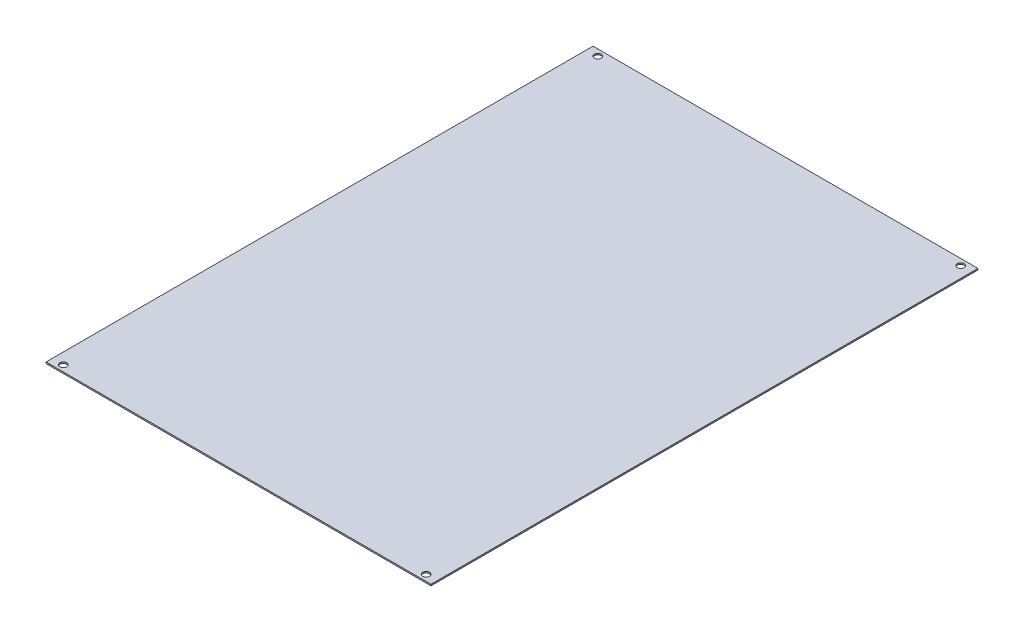
ISO-10303-21;
HEADER;
FILE_DESCRIPTION(('STEP AP214'),'2;1');
FILE_NAME('part.step','',(''),(''),'','','');
FILE_SCHEMA(('AUTOMOTIVE_DESIGN { 1 0 10303 214 1 1 1 1 }'));
ENDSEC;
DATA;
#1=APPLICATION_CONTEXT('core data for automotive mechanical design processes');
#2=APPLICATION_PROTOCOL_DEFINITION('international standard','automotive_design',2000,#1);
#3=PRODUCT_CONTEXT('',#1,'mechanical');
#4=PRODUCT('Part','Part','',(#3));
#5=PRODUCT_RELATED_PRODUCT_CATEGORY('part','',(#4));
#6=PRODUCT_DEFINITION_FORMATION('','',#4);
#7=PRODUCT_DEFINITION_CONTEXT('part definition',#1,'design');
#8=PRODUCT_DEFINITION('design','',#6,#7);
#9=PRODUCT_DEFINITION_SHAPE('','',#8);
#10=(LENGTH_UNIT() NAMED_UNIT(*) SI_UNIT(.MILLI.,.METRE.));
#11=(NAMED_UNIT(*) PLANE_ANGLE_UNIT() SI_UNIT($,.RADIAN.));
#12=(NAMED_UNIT(*) SI_UNIT($,.STERADIAN.) SOLID_ANGLE_UNIT());
#13=UNCERTAINTY_MEASURE_WITH_UNIT(LENGTH_MEASURE(1.E-05),#10,'distance_accuracy_value','');
#14=(GEOMETRIC_REPRESENTATION_CONTEXT(3) GLOBAL_UNCERTAINTY_ASSIGNED_CONTEXT((#13)) GLOBAL_UNIT_ASSIGNED_CONTEXT((#10,
#11,#12)) REPRESENTATION_CONTEXT('',''));
#15=CARTESIAN_POINT('',(0.,0.,0.));
#16=DIRECTION('',(0.,0.,1.));
#17=DIRECTION('',(1.,0.,0.));
#18=AXIS2_PLACEMENT_3D('',#15,#16,#17);
#19=CARTESIAN_POINT('',(-139.,-1.,197.5));
#20=DIRECTION('',(-1.,0.,0.));
#21=DIRECTION('',(0.,0.,1.));
#22=AXIS2_PLACEMENT_3D('',#19,#20,#21);
#23=PLANE('',#22);
#24=DIRECTION('',(0.,0.,1.));
#25=VECTOR('',#24,1.);
#26=CARTESIAN_POINT('',(-139.,0.,197.5));
#27=LINE('',#26,#25);
#28=CARTESIAN_POINT('',(-139.,0.,-197.5));
#29=VERTEX_POINT('',#28);
#30=CARTESIAN_POINT('',(-139.,0.,197.5));
#31=VERTEX_POINT('',#30);
#32=EDGE_CURVE('E109',#29,#31,#27,.T.);
#33=ORIENTED_EDGE('',*,*,#32,.F.);
#34=DIRECTION('',(0.,1.,0.));
#35=VECTOR('',#34,1.);
#36=CARTESIAN_POINT('',(-139.,-1.,-197.5));
#37=LINE('',#36,#35);
#38=CARTESIAN_POINT('',(-139.,-1.,-197.5));
#39=VERTEX_POINT('',#38);
#40=EDGE_CURVE('E11',#39,#29,#37,.T.);
#41=ORIENTED_EDGE('',*,*,#40,.F.);
#42=DIRECTION('',(0.,0.,1.));
#43=VECTOR('',#42,1.);
#44=CARTESIAN_POINT('',(-139.,-1.,197.5));
#45=LINE('',#44,#43);
#46=CARTESIAN_POINT('',(-139.,-1.,197.5));
#47=VERTEX_POINT('',#46);
#48=EDGE_CURVE('E102',#39,#47,#45,.T.);
#49=ORIENTED_EDGE('',*,*,#48,.T.);
#50=DIRECTION('',(0.,1.,0.));
#51=VECTOR('',#50,1.);
#52=CARTESIAN_POINT('',(-139.,-1.,197.5));
#53=LINE('',#52,#51);
#54=EDGE_CURVE('E47',#47,#31,#53,.T.);
#55=ORIENTED_EDGE('',*,*,#54,.T.);
#56=EDGE_LOOP('',(#33,#41,#49,#55));
#57=FACE_BOUND('',#56,.T.);
#58=ADVANCED_FACE('F44',(#57),#23,.T.);
#59=CARTESIAN_POINT('',(139.,-1.,-197.5));
#60=DIRECTION('',(0.,0.,-1.));
#61=DIRECTION('',(-1.,0.,0.));
#62=AXIS2_PLACEMENT_3D('',#59,#60,#61);
#63=PLANE('',#62);
#64=DIRECTION('',(-1.,0.,0.));
#65=VECTOR('',#64,1.);
#66=CARTESIAN_POINT('',(139.,0.,-197.5));
#67=LINE('',#66,#65);
#68=CARTESIAN_POINT('',(139.,0.,-197.5));
#69=VERTEX_POINT('',#68);
#70=EDGE_CURVE('E104',#69,#29,#67,.T.);
#71=ORIENTED_EDGE('',*,*,#70,.F.);
#72=DIRECTION('',(0.,1.,0.));
#73=VECTOR('',#72,1.);
#74=CARTESIAN_POINT('',(139.,-1.,-197.5));
#75=LINE('',#74,#73);
#76=CARTESIAN_POINT('',(139.,-1.,-197.5));
#77=VERTEX_POINT('',#76);
#78=EDGE_CURVE('E53',#77,#69,#75,.T.);
#79=ORIENTED_EDGE('',*,*,#78,.F.);
#80=DIRECTION('',(-1.,0.,0.));
#81=VECTOR('',#80,1.);
#82=CARTESIAN_POINT('',(139.,-1.,-197.5));
#83=LINE('',#82,#81);
#84=EDGE_CURVE('E99',#77,#39,#83,.T.);
#85=ORIENTED_EDGE('',*,*,#84,.T.);
#86=ORIENTED_EDGE('',*,*,#40,.T.);
#87=EDGE_LOOP('',(#71,#79,#85,#86));
#88=FACE_BOUND('',#87,.T.);
#89=ADVANCED_FACE('F120',(#88),#63,.T.);
#90=CARTESIAN_POINT('',(139.,-1.,197.5));
#91=DIRECTION('',(1.,0.,0.));
#92=DIRECTION('',(0.,0.,-1.));
#93=AXIS2_PLACEMENT_3D('',#90,#91,#92);
#94=PLANE('',#93);
#95=DIRECTION('',(0.,0.,-1.));
#96=VECTOR('',#95,1.);
#97=CARTESIAN_POINT('',(139.,0.,197.5));
#98=LINE('',#97,#96);
#99=CARTESIAN_POINT('',(139.,0.,197.5));
#100=VERTEX_POINT('',#99);
#101=EDGE_CURVE('E94',#100,#69,#98,.T.);
#102=ORIENTED_EDGE('',*,*,#101,.F.);
#103=DIRECTION('',(0.,1.,0.));
#104=VECTOR('',#103,1.);
#105=CARTESIAN_POINT('',(139.,-1.,197.5));
#106=LINE('',#105,#104);
#107=CARTESIAN_POINT('',(139.,-1.,197.5));
#108=VERTEX_POINT('',#107);
#109=EDGE_CURVE('E89',#108,#100,#106,.T.);
#110=ORIENTED_EDGE('',*,*,#109,.F.);
#111=DIRECTION('',(0.,0.,-1.));
#112=VECTOR('',#111,1.);
#113=CARTESIAN_POINT('',(139.,-1.,197.5));
#114=LINE('',#113,#112);
#115=EDGE_CURVE('E92',#108,#77,#114,.T.);
#116=ORIENTED_EDGE('',*,*,#115,.T.);
#117=ORIENTED_EDGE('',*,*,#78,.T.);
#118=EDGE_LOOP('',(#102,#110,#116,#117));
#119=FACE_BOUND('',#118,.T.);
#120=ADVANCED_FACE('F91',(#119),#94,.T.);
#121=CARTESIAN_POINT('',(139.,-1.,197.5));
#122=DIRECTION('',(0.,0.,1.));
#123=DIRECTION('',(1.,0.,0.));
#124=AXIS2_PLACEMENT_3D('',#121,#122,#123);
#125=PLANE('',#124);
#126=DIRECTION('',(1.,0.,0.));
#127=VECTOR('',#126,1.);
#128=CARTESIAN_POINT('',(139.,0.,197.5));
#129=LINE('',#128,#127);
#130=EDGE_CURVE('E112',#31,#100,#129,.T.);
#131=ORIENTED_EDGE('',*,*,#130,.F.);
#132=ORIENTED_EDGE('',*,*,#54,.F.);
#133=DIRECTION('',(1.,0.,0.));
#134=VECTOR('',#133,1.);
#135=CARTESIAN_POINT('',(139.,-1.,197.5));
#136=LINE('',#135,#134);
#137=EDGE_CURVE('E98',#47,#108,#136,.T.);
#138=ORIENTED_EDGE('',*,*,#137,.T.);
#139=ORIENTED_EDGE('',*,*,#109,.T.);
#140=EDGE_LOOP('',(#131,#132,#138,#139));
#141=FACE_BOUND('',#140,.T.);
#142=ADVANCED_FACE('F101',(#141),#125,.T.);
#143=CARTESIAN_POINT('',(0.,-1.,0.));
#144=DIRECTION('',(0.,1.,0.));
#145=DIRECTION('',(0.,0.,1.));
#146=AXIS2_PLACEMENT_3D('',#143,#144,#145);
#147=PLANE('',#146);
#148=CARTESIAN_POINT('',(-131.,-1.,193.));
#149=DIRECTION('',(0.,1.,0.));
#150=DIRECTION('',(0.,0.,1.));
#151=AXIS2_PLACEMENT_3D('',#148,#149,#150);
#152=CIRCLE('',#151,2.5);
#153=CARTESIAN_POINT('',(-131.,-1.,195.5));
#154=VERTEX_POINT('',#153);
#155=EDGE_CURVE('E181',#154,#154,#152,.T.);
#156=ORIENTED_EDGE('',*,*,#155,.T.);
#157=EDGE_LOOP('',(#156));
#158=FACE_BOUND('',#157,.T.);
#159=CARTESIAN_POINT('',(131.,-1.,193.));
#160=DIRECTION('',(0.,1.,0.));
#161=DIRECTION('',(0.,0.,1.));
#162=AXIS2_PLACEMENT_3D('',#159,#160,#161);
#163=CIRCLE('',#162,2.5);
#164=CARTESIAN_POINT('',(131.,-1.,195.5));
#165=VERTEX_POINT('',#164);
#166=EDGE_CURVE('E175',#165,#165,#163,.T.);
#167=ORIENTED_EDGE('',*,*,#166,.T.);
#168=EDGE_LOOP('',(#167));
#169=FACE_BOUND('',#168,.T.);
#170=CARTESIAN_POINT('',(131.,-1.,-193.));
#171=DIRECTION('',(0.,1.,0.));
#172=DIRECTION('',(0.,0.,1.));
#173=AXIS2_PLACEMENT_3D('',#170,#171,#172);
#174=CIRCLE('',#173,2.5);
#175=CARTESIAN_POINT('',(131.,-1.,-190.5));
#176=VERTEX_POINT('',#175);
#177=EDGE_CURVE('E162',#176,#176,#174,.T.);
#178=ORIENTED_EDGE('',*,*,#177,.T.);
#179=EDGE_LOOP('',(#178));
#180=FACE_BOUND('',#179,.T.);
#181=CARTESIAN_POINT('',(-131.,-1.,-193.));
#182=DIRECTION('',(0.,1.,0.));
#183=DIRECTION('',(0.,0.,1.));
#184=AXIS2_PLACEMENT_3D('',#181,#182,#183);
#185=CIRCLE('',#184,2.5);
#186=CARTESIAN_POINT('',(-131.,-1.,-190.5));
#187=VERTEX_POINT('',#186);
#188=EDGE_CURVE('E113',#187,#187,#185,.T.);
#189=ORIENTED_EDGE('',*,*,#188,.T.);
#190=EDGE_LOOP('',(#189));
#191=FACE_BOUND('',#190,.T.);
#192=ORIENTED_EDGE('',*,*,#48,.F.);
#193=ORIENTED_EDGE('',*,*,#84,.F.);
#194=ORIENTED_EDGE('',*,*,#115,.F.);
#195=ORIENTED_EDGE('',*,*,#137,.F.);
#196=EDGE_LOOP('',(#192,#193,#194,#195));
#197=FACE_BOUND('',#196,.T.);
#198=ADVANCED_FACE('F97',(#158,#169,#180,#191,#197),#147,.F.);
#199=CARTESIAN_POINT('',(0.,0.,0.));
#200=DIRECTION('',(0.,1.,0.));
#201=DIRECTION('',(0.,0.,1.));
#202=AXIS2_PLACEMENT_3D('',#199,#200,#201);
#203=PLANE('',#202);
#204=CARTESIAN_POINT('',(-131.,0.,193.));
#205=DIRECTION('',(0.,1.,0.));
#206=DIRECTION('',(0.,0.,1.));
#207=AXIS2_PLACEMENT_3D('',#204,#205,#206);
#208=CIRCLE('',#207,2.5);
#209=CARTESIAN_POINT('',(-131.,0.,195.5));
#210=VERTEX_POINT('',#209);
#211=EDGE_CURVE('E178',#210,#210,#208,.T.);
#212=ORIENTED_EDGE('',*,*,#211,.F.);
#213=EDGE_LOOP('',(#212));
#214=FACE_BOUND('',#213,.T.);
#215=CARTESIAN_POINT('',(131.,0.,193.));
#216=DIRECTION('',(0.,1.,0.));
#217=DIRECTION('',(0.,0.,1.));
#218=AXIS2_PLACEMENT_3D('',#215,#216,#217);
#219=CIRCLE('',#218,2.5);
#220=CARTESIAN_POINT('',(131.,0.,195.5));
#221=VERTEX_POINT('',#220);
#222=EDGE_CURVE('E170',#221,#221,#219,.T.);
#223=ORIENTED_EDGE('',*,*,#222,.F.);
#224=EDGE_LOOP('',(#223));
#225=FACE_BOUND('',#224,.T.);
#226=CARTESIAN_POINT('',(131.,0.,-193.));
#227=DIRECTION('',(0.,1.,0.));
#228=DIRECTION('',(0.,0.,1.));
#229=AXIS2_PLACEMENT_3D('',#226,#227,#228);
#230=CIRCLE('',#229,2.5);
#231=CARTESIAN_POINT('',(131.,0.,-190.5));
#232=VERTEX_POINT('',#231);
#233=EDGE_CURVE('E165',#232,#232,#230,.T.);
#234=ORIENTED_EDGE('',*,*,#233,.F.);
#235=EDGE_LOOP('',(#234));
#236=FACE_BOUND('',#235,.T.);
#237=CARTESIAN_POINT('',(-131.,0.,-193.));
#238=DIRECTION('',(0.,1.,0.));
#239=DIRECTION('',(0.,0.,1.));
#240=AXIS2_PLACEMENT_3D('',#237,#238,#239);
#241=CIRCLE('',#240,2.5);
#242=CARTESIAN_POINT('',(-131.,0.,-190.5));
#243=VERTEX_POINT('',#242);
#244=EDGE_CURVE('E167',#243,#243,#241,.T.);
#245=ORIENTED_EDGE('',*,*,#244,.F.);
#246=EDGE_LOOP('',(#245));
#247=FACE_BOUND('',#246,.T.);
#248=ORIENTED_EDGE('',*,*,#32,.T.);
#249=ORIENTED_EDGE('',*,*,#130,.T.);
#250=ORIENTED_EDGE('',*,*,#101,.T.);
#251=ORIENTED_EDGE('',*,*,#70,.T.);
#252=EDGE_LOOP('',(#248,#249,#250,#251));
#253=FACE_BOUND('',#252,.T.);
#254=ADVANCED_FACE('F119',(#214,#225,#236,#247,#253),#203,.T.);
#255=CARTESIAN_POINT('',(-131.,-1.,-193.));
#256=DIRECTION('',(0.,1.,0.));
#257=DIRECTION('',(0.,0.,1.));
#258=AXIS2_PLACEMENT_3D('',#255,#256,#257);
#259=CYLINDRICAL_SURFACE('',#258,2.5);
#260=ORIENTED_EDGE('',*,*,#188,.F.);
#261=EDGE_LOOP('',(#260));
#262=FACE_BOUND('',#261,.T.);
#263=ORIENTED_EDGE('',*,*,#244,.T.);
#264=EDGE_LOOP('',(#263));
#265=FACE_BOUND('',#264,.T.);
#266=ADVANCED_FACE('F138',(#262,#265),#259,.F.);
#267=CARTESIAN_POINT('',(131.,-1.,-193.));
#268=DIRECTION('',(0.,1.,0.));
#269=DIRECTION('',(0.,0.,1.));
#270=AXIS2_PLACEMENT_3D('',#267,#268,#269);
#271=CYLINDRICAL_SURFACE('',#270,2.5);
#272=ORIENTED_EDGE('',*,*,#177,.F.);
#273=EDGE_LOOP('',(#272));
#274=FACE_BOUND('',#273,.T.);
#275=ORIENTED_EDGE('',*,*,#233,.T.);
#276=EDGE_LOOP('',(#275));
#277=FACE_BOUND('',#276,.T.);
#278=ADVANCED_FACE('F145',(#274,#277),#271,.F.);
#279=CARTESIAN_POINT('',(131.,-1.,193.));
#280=DIRECTION('',(0.,1.,0.));
#281=DIRECTION('',(0.,0.,1.));
#282=AXIS2_PLACEMENT_3D('',#279,#280,#281);
#283=CYLINDRICAL_SURFACE('',#282,2.5);
#284=ORIENTED_EDGE('',*,*,#166,.F.);
#285=EDGE_LOOP('',(#284));
#286=FACE_BOUND('',#285,.T.);
#287=ORIENTED_EDGE('',*,*,#222,.T.);
#288=EDGE_LOOP('',(#287));
#289=FACE_BOUND('',#288,.T.);
#290=ADVANCED_FACE('F150',(#286,#289),#283,.F.);
#291=CARTESIAN_POINT('',(-131.,-1.,193.));
#292=DIRECTION('',(0.,1.,0.));
#293=DIRECTION('',(0.,0.,1.));
#294=AXIS2_PLACEMENT_3D('',#291,#292,#293);
#295=CYLINDRICAL_SURFACE('',#294,2.5);
#296=ORIENTED_EDGE('',*,*,#155,.F.);
#297=EDGE_LOOP('',(#296));
#298=FACE_BOUND('',#297,.T.);
#299=ORIENTED_EDGE('',*,*,#211,.T.);
#300=EDGE_LOOP('',(#299));
#301=FACE_BOUND('',#300,.T.);
#302=ADVANCED_FACE('F147',(#298,#301),#295,.F.);
#303=CLOSED_SHELL('',(#58,#89,#120,#142,#198,#254,#266,#278,#290,#302));
#304=MANIFOLD_SOLID_BREP('B2',#303);
#305=ADVANCED_BREP_SHAPE_REPRESENTATION('',(#18,#304),#14);
#306=SHAPE_DEFINITION_REPRESENTATION(#9,#305);
ENDSEC;
END-ISO-10303-21;
